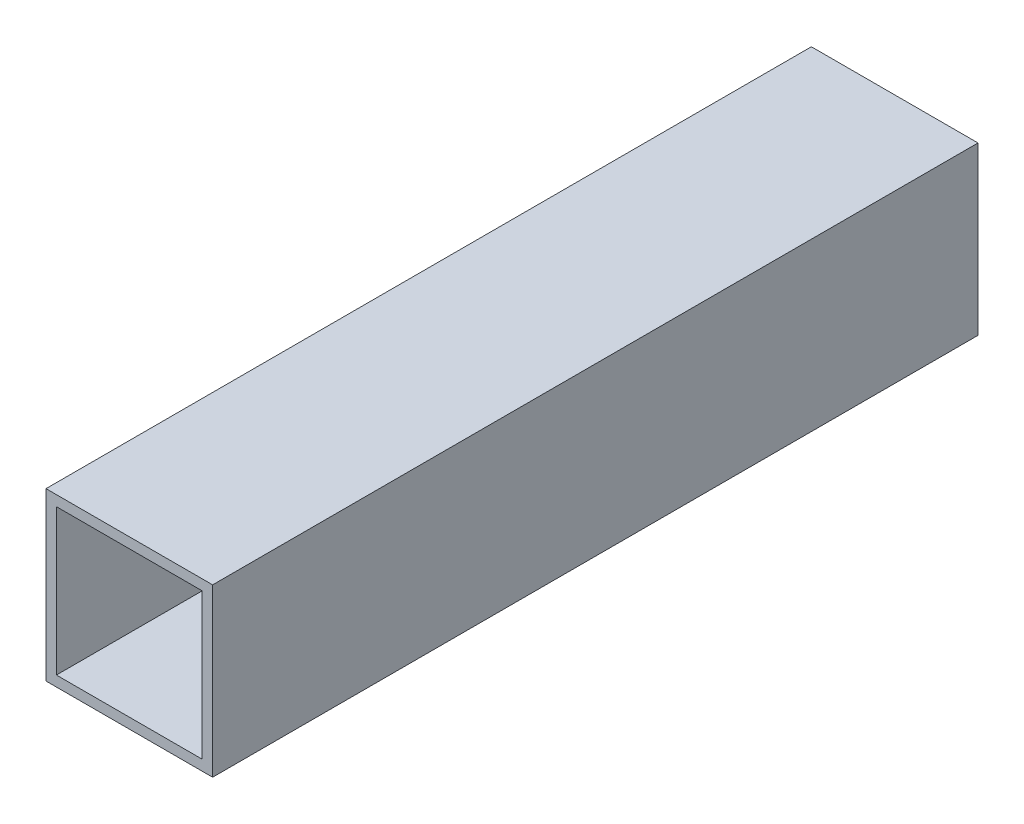
ISO-10303-21;
HEADER;
FILE_DESCRIPTION(('STEP AP214'),'2;1');
FILE_NAME('part.step','',(''),(''),'','','');
FILE_SCHEMA(('AUTOMOTIVE_DESIGN { 1 0 10303 214 1 1 1 1 }'));
ENDSEC;
DATA;
#1=APPLICATION_CONTEXT('core data for automotive mechanical design processes');
#2=APPLICATION_PROTOCOL_DEFINITION('international standard','automotive_design',2000,#1);
#3=PRODUCT_CONTEXT('',#1,'mechanical');
#4=PRODUCT('Part','Part','',(#3));
#5=PRODUCT_RELATED_PRODUCT_CATEGORY('part','',(#4));
#6=PRODUCT_DEFINITION_FORMATION('','',#4);
#7=PRODUCT_DEFINITION_CONTEXT('part definition',#1,'design');
#8=PRODUCT_DEFINITION('design','',#6,#7);
#9=PRODUCT_DEFINITION_SHAPE('','',#8);
#10=(LENGTH_UNIT() NAMED_UNIT(*) SI_UNIT(.MILLI.,.METRE.));
#11=(NAMED_UNIT(*) PLANE_ANGLE_UNIT() SI_UNIT($,.RADIAN.));
#12=(NAMED_UNIT(*) SI_UNIT($,.STERADIAN.) SOLID_ANGLE_UNIT());
#13=UNCERTAINTY_MEASURE_WITH_UNIT(LENGTH_MEASURE(1.E-05),#10,'distance_accuracy_value','');
#14=(GEOMETRIC_REPRESENTATION_CONTEXT(3) GLOBAL_UNCERTAINTY_ASSIGNED_CONTEXT((#13)) GLOBAL_UNIT_ASSIGNED_CONTEXT((#10,
#11,#12)) REPRESENTATION_CONTEXT('',''));
#15=CARTESIAN_POINT('',(0.,0.,0.));
#16=DIRECTION('',(0.,0.,1.));
#17=DIRECTION('',(1.,0.,0.));
#18=AXIS2_PLACEMENT_3D('',#15,#16,#17);
#19=CARTESIAN_POINT('',(0.,0.,-350.));
#20=DIRECTION('',(-1.,0.,0.));
#21=DIRECTION('',(0.,-1.,0.));
#22=AXIS2_PLACEMENT_3D('',#19,#20,#21);
#23=PLANE('',#22);
#24=DIRECTION('',(0.,-1.,0.));
#25=VECTOR('',#24,1.);
#26=CARTESIAN_POINT('',(0.,0.,0.));
#27=LINE('',#26,#25);
#28=CARTESIAN_POINT('',(0.,0.,0.));
#29=VERTEX_POINT('',#28);
#30=CARTESIAN_POINT('',(0.,-76.2,0.));
#31=VERTEX_POINT('',#30);
#32=EDGE_CURVE('E134',#29,#31,#27,.T.);
#33=ORIENTED_EDGE('',*,*,#32,.F.);
#34=DIRECTION('',(0.,0.,1.));
#35=VECTOR('',#34,1.);
#36=CARTESIAN_POINT('',(0.,0.,-350.));
#37=LINE('',#36,#35);
#38=CARTESIAN_POINT('',(0.,0.,-350.));
#39=VERTEX_POINT('',#38);
#40=EDGE_CURVE('E11',#39,#29,#37,.T.);
#41=ORIENTED_EDGE('',*,*,#40,.F.);
#42=DIRECTION('',(0.,-1.,0.));
#43=VECTOR('',#42,1.);
#44=CARTESIAN_POINT('',(0.,0.,-350.));
#45=LINE('',#44,#43);
#46=CARTESIAN_POINT('',(0.,-76.2,-350.));
#47=VERTEX_POINT('',#46);
#48=EDGE_CURVE('E138',#39,#47,#45,.T.);
#49=ORIENTED_EDGE('',*,*,#48,.T.);
#50=DIRECTION('',(0.,0.,1.));
#51=VECTOR('',#50,1.);
#52=CARTESIAN_POINT('',(0.,-76.2,-350.));
#53=LINE('',#52,#51);
#54=EDGE_CURVE('E39',#47,#31,#53,.T.);
#55=ORIENTED_EDGE('',*,*,#54,.T.);
#56=EDGE_LOOP('',(#33,#41,#49,#55));
#57=FACE_BOUND('',#56,.T.);
#58=ADVANCED_FACE('F36',(#57),#23,.T.);
#59=CARTESIAN_POINT('',(0.,0.,-350.));
#60=DIRECTION('',(0.,1.,0.));
#61=DIRECTION('',(0.,0.,1.));
#62=AXIS2_PLACEMENT_3D('',#59,#60,#61);
#63=PLANE('',#62);
#64=DIRECTION('',(-1.,0.,0.));
#65=VECTOR('',#64,1.);
#66=CARTESIAN_POINT('',(0.,0.,0.));
#67=LINE('',#66,#65);
#68=CARTESIAN_POINT('',(76.2,0.,0.));
#69=VERTEX_POINT('',#68);
#70=EDGE_CURVE('E142',#69,#29,#67,.T.);
#71=ORIENTED_EDGE('',*,*,#70,.F.);
#72=DIRECTION('',(0.,0.,1.));
#73=VECTOR('',#72,1.);
#74=CARTESIAN_POINT('',(76.2,0.,-350.));
#75=LINE('',#74,#73);
#76=CARTESIAN_POINT('',(76.2,0.,-350.));
#77=VERTEX_POINT('',#76);
#78=EDGE_CURVE('E44',#77,#69,#75,.T.);
#79=ORIENTED_EDGE('',*,*,#78,.F.);
#80=DIRECTION('',(-1.,0.,0.));
#81=VECTOR('',#80,1.);
#82=CARTESIAN_POINT('',(0.,0.,-350.));
#83=LINE('',#82,#81);
#84=EDGE_CURVE('E148',#77,#39,#83,.T.);
#85=ORIENTED_EDGE('',*,*,#84,.T.);
#86=ORIENTED_EDGE('',*,*,#40,.T.);
#87=EDGE_LOOP('',(#71,#79,#85,#86));
#88=FACE_BOUND('',#87,.T.);
#89=ADVANCED_FACE('F174',(#88),#63,.T.);
#90=CARTESIAN_POINT('',(76.2,0.,-350.));
#91=DIRECTION('',(1.,0.,0.));
#92=DIRECTION('',(0.,1.,0.));
#93=AXIS2_PLACEMENT_3D('',#90,#91,#92);
#94=PLANE('',#93);
#95=DIRECTION('',(0.,1.,0.));
#96=VECTOR('',#95,1.);
#97=CARTESIAN_POINT('',(76.2,0.,0.));
#98=LINE('',#97,#96);
#99=CARTESIAN_POINT('',(76.2,-76.2,0.));
#100=VERTEX_POINT('',#99);
#101=EDGE_CURVE('E156',#100,#69,#98,.T.);
#102=ORIENTED_EDGE('',*,*,#101,.F.);
#103=DIRECTION('',(0.,0.,1.));
#104=VECTOR('',#103,1.);
#105=CARTESIAN_POINT('',(76.2,-76.2,-350.));
#106=LINE('',#105,#104);
#107=CARTESIAN_POINT('',(76.2,-76.2,-350.));
#108=VERTEX_POINT('',#107);
#109=EDGE_CURVE('E161',#108,#100,#106,.T.);
#110=ORIENTED_EDGE('',*,*,#109,.F.);
#111=DIRECTION('',(0.,1.,0.));
#112=VECTOR('',#111,1.);
#113=CARTESIAN_POINT('',(76.2,0.,-350.));
#114=LINE('',#113,#112);
#115=EDGE_CURVE('E145',#108,#77,#114,.T.);
#116=ORIENTED_EDGE('',*,*,#115,.T.);
#117=ORIENTED_EDGE('',*,*,#78,.T.);
#118=EDGE_LOOP('',(#102,#110,#116,#117));
#119=FACE_BOUND('',#118,.T.);
#120=ADVANCED_FACE('F178',(#119),#94,.T.);
#121=CARTESIAN_POINT('',(0.,-76.2,-350.));
#122=DIRECTION('',(0.,-1.,0.));
#123=DIRECTION('',(0.,0.,-1.));
#124=AXIS2_PLACEMENT_3D('',#121,#122,#123);
#125=PLANE('',#124);
#126=DIRECTION('',(1.,0.,0.));
#127=VECTOR('',#126,1.);
#128=CARTESIAN_POINT('',(0.,-76.2,0.));
#129=LINE('',#128,#127);
#130=EDGE_CURVE('E153',#31,#100,#129,.T.);
#131=ORIENTED_EDGE('',*,*,#130,.F.);
#132=ORIENTED_EDGE('',*,*,#54,.F.);
#133=DIRECTION('',(1.,0.,0.));
#134=VECTOR('',#133,1.);
#135=CARTESIAN_POINT('',(0.,-76.2,-350.));
#136=LINE('',#135,#134);
#137=EDGE_CURVE('E141',#47,#108,#136,.T.);
#138=ORIENTED_EDGE('',*,*,#137,.T.);
#139=ORIENTED_EDGE('',*,*,#109,.T.);
#140=EDGE_LOOP('',(#131,#132,#138,#139));
#141=FACE_BOUND('',#140,.T.);
#142=ADVANCED_FACE('F169',(#141),#125,.T.);
#143=CARTESIAN_POINT('',(0.,0.,-350.));
#144=DIRECTION('',(0.,0.,1.));
#145=DIRECTION('',(1.,0.,0.));
#146=AXIS2_PLACEMENT_3D('',#143,#144,#145);
#147=PLANE('',#146);
#148=DIRECTION('',(-1.,0.,0.));
#149=VECTOR('',#148,1.);
#150=CARTESIAN_POINT('',(4.7625,-4.7625,-350.));
#151=LINE('',#150,#149);
#152=CARTESIAN_POINT('',(71.4375,-4.7625,-350.));
#153=VERTEX_POINT('',#152);
#154=CARTESIAN_POINT('',(4.7625,-4.7625,-350.));
#155=VERTEX_POINT('',#154);
#156=EDGE_CURVE('E109',#153,#155,#151,.T.);
#157=ORIENTED_EDGE('',*,*,#156,.T.);
#158=DIRECTION('',(0.,-1.,0.));
#159=VECTOR('',#158,1.);
#160=CARTESIAN_POINT('',(4.7625,-4.7625,-350.));
#161=LINE('',#160,#159);
#162=CARTESIAN_POINT('',(4.7625,-71.4375,-350.));
#163=VERTEX_POINT('',#162);
#164=EDGE_CURVE('E103',#155,#163,#161,.T.);
#165=ORIENTED_EDGE('',*,*,#164,.T.);
#166=DIRECTION('',(1.,0.,0.));
#167=VECTOR('',#166,1.);
#168=CARTESIAN_POINT('',(4.7625,-71.4375,-350.));
#169=LINE('',#168,#167);
#170=CARTESIAN_POINT('',(71.4375,-71.4375,-350.));
#171=VERTEX_POINT('',#170);
#172=EDGE_CURVE('E112',#163,#171,#169,.T.);
#173=ORIENTED_EDGE('',*,*,#172,.T.);
#174=DIRECTION('',(0.,1.,0.));
#175=VECTOR('',#174,1.);
#176=CARTESIAN_POINT('',(71.4375,-4.7625,-350.));
#177=LINE('',#176,#175);
#178=EDGE_CURVE('E52',#171,#153,#177,.T.);
#179=ORIENTED_EDGE('',*,*,#178,.T.);
#180=EDGE_LOOP('',(#157,#165,#173,#179));
#181=FACE_BOUND('',#180,.T.);
#182=ORIENTED_EDGE('',*,*,#48,.F.);
#183=ORIENTED_EDGE('',*,*,#84,.F.);
#184=ORIENTED_EDGE('',*,*,#115,.F.);
#185=ORIENTED_EDGE('',*,*,#137,.F.);
#186=EDGE_LOOP('',(#182,#183,#184,#185));
#187=FACE_BOUND('',#186,.T.);
#188=ADVANCED_FACE('F116',(#181,#187),#147,.F.);
#189=CARTESIAN_POINT('',(0.,0.,0.));
#190=DIRECTION('',(0.,0.,1.));
#191=DIRECTION('',(1.,0.,0.));
#192=AXIS2_PLACEMENT_3D('',#189,#190,#191);
#193=PLANE('',#192);
#194=DIRECTION('',(0.,-1.,0.));
#195=VECTOR('',#194,1.);
#196=CARTESIAN_POINT('',(4.7625,-4.7625,0.));
#197=LINE('',#196,#195);
#198=CARTESIAN_POINT('',(4.7625,-4.7625,0.));
#199=VERTEX_POINT('',#198);
#200=CARTESIAN_POINT('',(4.7625,-71.4375,0.));
#201=VERTEX_POINT('',#200);
#202=EDGE_CURVE('E60',#199,#201,#197,.T.);
#203=ORIENTED_EDGE('',*,*,#202,.F.);
#204=DIRECTION('',(-1.,0.,0.));
#205=VECTOR('',#204,1.);
#206=CARTESIAN_POINT('',(4.7625,-4.7625,0.));
#207=LINE('',#206,#205);
#208=CARTESIAN_POINT('',(71.4375,-4.7625,0.));
#209=VERTEX_POINT('',#208);
#210=EDGE_CURVE('E119',#209,#199,#207,.T.);
#211=ORIENTED_EDGE('',*,*,#210,.F.);
#212=DIRECTION('',(0.,1.,0.));
#213=VECTOR('',#212,1.);
#214=CARTESIAN_POINT('',(71.4375,-4.7625,0.));
#215=LINE('',#214,#213);
#216=CARTESIAN_POINT('',(71.4375,-71.4375,0.));
#217=VERTEX_POINT('',#216);
#218=EDGE_CURVE('E122',#217,#209,#215,.T.);
#219=ORIENTED_EDGE('',*,*,#218,.F.);
#220=DIRECTION('',(1.,0.,0.));
#221=VECTOR('',#220,1.);
#222=CARTESIAN_POINT('',(4.7625,-71.4375,0.));
#223=LINE('',#222,#221);
#224=EDGE_CURVE('E128',#201,#217,#223,.T.);
#225=ORIENTED_EDGE('',*,*,#224,.F.);
#226=EDGE_LOOP('',(#203,#211,#219,#225));
#227=FACE_BOUND('',#226,.T.);
#228=ORIENTED_EDGE('',*,*,#32,.T.);
#229=ORIENTED_EDGE('',*,*,#130,.T.);
#230=ORIENTED_EDGE('',*,*,#101,.T.);
#231=ORIENTED_EDGE('',*,*,#70,.T.);
#232=EDGE_LOOP('',(#228,#229,#230,#231));
#233=FACE_BOUND('',#232,.T.);
#234=ADVANCED_FACE('F171',(#227,#233),#193,.T.);
#235=CARTESIAN_POINT('',(4.7625,-4.7625,-350.));
#236=DIRECTION('',(-1.,0.,0.));
#237=DIRECTION('',(0.,0.,1.));
#238=AXIS2_PLACEMENT_3D('',#235,#236,#237);
#239=PLANE('',#238);
#240=ORIENTED_EDGE('',*,*,#202,.T.);
#241=DIRECTION('',(0.,0.,1.));
#242=VECTOR('',#241,1.);
#243=CARTESIAN_POINT('',(4.7625,-71.4375,-350.));
#244=LINE('',#243,#242);
#245=EDGE_CURVE('E99',#163,#201,#244,.T.);
#246=ORIENTED_EDGE('',*,*,#245,.F.);
#247=ORIENTED_EDGE('',*,*,#164,.F.);
#248=DIRECTION('',(0.,0.,1.));
#249=VECTOR('',#248,1.);
#250=CARTESIAN_POINT('',(4.7625,-4.7625,-350.));
#251=LINE('',#250,#249);
#252=EDGE_CURVE('E132',#155,#199,#251,.T.);
#253=ORIENTED_EDGE('',*,*,#252,.T.);
#254=EDGE_LOOP('',(#240,#246,#247,#253));
#255=FACE_BOUND('',#254,.T.);
#256=ADVANCED_FACE('F101',(#255),#239,.F.);
#257=CARTESIAN_POINT('',(4.7625,-4.7625,-350.));
#258=DIRECTION('',(0.,1.,0.));
#259=DIRECTION('',(0.,0.,1.));
#260=AXIS2_PLACEMENT_3D('',#257,#258,#259);
#261=PLANE('',#260);
#262=ORIENTED_EDGE('',*,*,#210,.T.);
#263=ORIENTED_EDGE('',*,*,#252,.F.);
#264=ORIENTED_EDGE('',*,*,#156,.F.);
#265=DIRECTION('',(0.,0.,1.));
#266=VECTOR('',#265,1.);
#267=CARTESIAN_POINT('',(71.4375,-4.7625,-350.));
#268=LINE('',#267,#266);
#269=EDGE_CURVE('E135',#153,#209,#268,.T.);
#270=ORIENTED_EDGE('',*,*,#269,.T.);
#271=EDGE_LOOP('',(#262,#263,#264,#270));
#272=FACE_BOUND('',#271,.T.);
#273=ADVANCED_FACE('F229',(#272),#261,.F.);
#274=CARTESIAN_POINT('',(71.4375,-4.7625,-350.));
#275=DIRECTION('',(1.,0.,0.));
#276=DIRECTION('',(0.,0.,-1.));
#277=AXIS2_PLACEMENT_3D('',#274,#275,#276);
#278=PLANE('',#277);
#279=ORIENTED_EDGE('',*,*,#218,.T.);
#280=ORIENTED_EDGE('',*,*,#269,.F.);
#281=ORIENTED_EDGE('',*,*,#178,.F.);
#282=DIRECTION('',(0.,0.,1.));
#283=VECTOR('',#282,1.);
#284=CARTESIAN_POINT('',(71.4375,-71.4375,-350.));
#285=LINE('',#284,#283);
#286=EDGE_CURVE('E108',#171,#217,#285,.T.);
#287=ORIENTED_EDGE('',*,*,#286,.T.);
#288=EDGE_LOOP('',(#279,#280,#281,#287));
#289=FACE_BOUND('',#288,.T.);
#290=ADVANCED_FACE('F238',(#289),#278,.F.);
#291=CARTESIAN_POINT('',(4.7625,-71.4375,-350.));
#292=DIRECTION('',(0.,-1.,0.));
#293=DIRECTION('',(0.,0.,-1.));
#294=AXIS2_PLACEMENT_3D('',#291,#292,#293);
#295=PLANE('',#294);
#296=ORIENTED_EDGE('',*,*,#224,.T.);
#297=ORIENTED_EDGE('',*,*,#286,.F.);
#298=ORIENTED_EDGE('',*,*,#172,.F.);
#299=ORIENTED_EDGE('',*,*,#245,.T.);
#300=EDGE_LOOP('',(#296,#297,#298,#299));
#301=FACE_BOUND('',#300,.T.);
#302=ADVANCED_FACE('F113',(#301),#295,.F.);
#303=CLOSED_SHELL('',(#58,#89,#120,#142,#188,#234,#256,#273,#290,#302));
#304=MANIFOLD_SOLID_BREP('B2',#303);
#305=ADVANCED_BREP_SHAPE_REPRESENTATION('',(#18,#304),#14);
#306=SHAPE_DEFINITION_REPRESENTATION(#9,#305);
ENDSEC;
END-ISO-10303-21;
